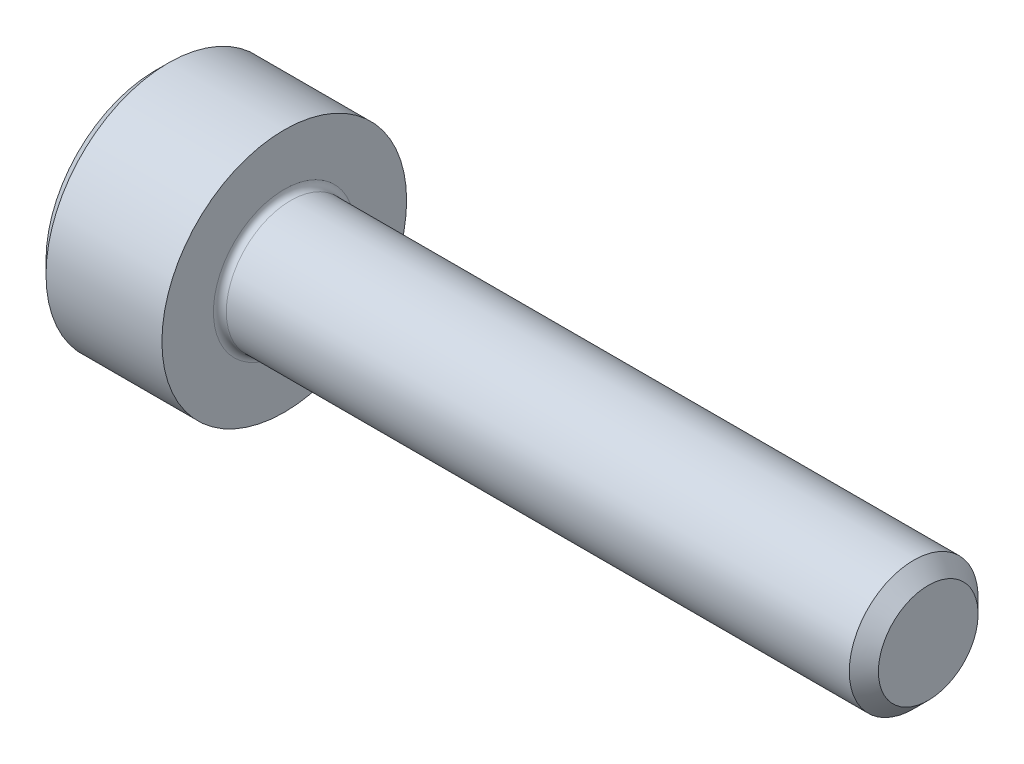
ISO-10303-21;
HEADER;
FILE_DESCRIPTION(('STEP AP214'),'2;1');
FILE_NAME('part.step','',(''),(''),'','','');
FILE_SCHEMA(('AUTOMOTIVE_DESIGN { 1 0 10303 214 1 1 1 1 }'));
ENDSEC;
DATA;
#1=APPLICATION_CONTEXT('core data for automotive mechanical design processes');
#2=APPLICATION_PROTOCOL_DEFINITION('international standard','automotive_design',2000,#1);
#3=PRODUCT_CONTEXT('',#1,'mechanical');
#4=PRODUCT('Part','Part','',(#3));
#5=PRODUCT_RELATED_PRODUCT_CATEGORY('part','',(#4));
#6=PRODUCT_DEFINITION_FORMATION('','',#4);
#7=PRODUCT_DEFINITION_CONTEXT('part definition',#1,'design');
#8=PRODUCT_DEFINITION('design','',#6,#7);
#9=PRODUCT_DEFINITION_SHAPE('','',#8);
#10=(LENGTH_UNIT() NAMED_UNIT(*) SI_UNIT(.MILLI.,.METRE.));
#11=(NAMED_UNIT(*) PLANE_ANGLE_UNIT() SI_UNIT($,.RADIAN.));
#12=(NAMED_UNIT(*) SI_UNIT($,.STERADIAN.) SOLID_ANGLE_UNIT());
#13=UNCERTAINTY_MEASURE_WITH_UNIT(LENGTH_MEASURE(1.E-05),#10,'distance_accuracy_value','');
#14=(GEOMETRIC_REPRESENTATION_CONTEXT(3) GLOBAL_UNCERTAINTY_ASSIGNED_CONTEXT((#13)) GLOBAL_UNIT_ASSIGNED_CONTEXT((#10,
#11,#12)) REPRESENTATION_CONTEXT('',''));
#15=CARTESIAN_POINT('',(0.,0.,0.));
#16=DIRECTION('',(0.,0.,1.));
#17=DIRECTION('',(1.,0.,0.));
#18=AXIS2_PLACEMENT_3D('',#15,#16,#17);
#19=CARTESIAN_POINT('',(0.,0.,0.));
#20=DIRECTION('',(-1.,0.,0.));
#21=DIRECTION('',(0.,0.,1.));
#22=AXIS2_PLACEMENT_3D('',#19,#20,#21);
#23=PLANE('',#22);
#24=DIRECTION('',(0.,-0.499999999999999,0.866025403784439));
#25=VECTOR('',#24,1.);
#26=CARTESIAN_POINT('',(0.,0.892006165897969,0.));
#27=LINE('',#26,#25);
#28=CARTESIAN_POINT('',(0.,0.892006165897969,0.));
#29=VERTEX_POINT('',#28);
#30=CARTESIAN_POINT('',(0.,0.446003082948983,0.772499999999997));
#31=VERTEX_POINT('',#30);
#32=EDGE_CURVE('E388',#29,#31,#27,.T.);
#33=ORIENTED_EDGE('',*,*,#32,.T.);
#34=DIRECTION('',(0.,1.,0.));
#35=VECTOR('',#34,1.);
#36=CARTESIAN_POINT('',(0.,-0.446003082948989,0.772499999999998));
#37=LINE('',#36,#35);
#38=CARTESIAN_POINT('',(0.,-0.446003082948989,0.772499999999998));
#39=VERTEX_POINT('',#38);
#40=EDGE_CURVE('E132',#39,#31,#37,.T.);
#41=ORIENTED_EDGE('',*,*,#40,.F.);
#42=DIRECTION('',(0.,-0.500000000000001,-0.866025403784438));
#43=VECTOR('',#42,1.);
#44=CARTESIAN_POINT('',(0.,-0.446003082948989,0.772499999999998));
#45=LINE('',#44,#43);
#46=CARTESIAN_POINT('',(0.,-0.892006165897975,0.));
#47=VERTEX_POINT('',#46);
#48=EDGE_CURVE('E391',#39,#47,#45,.T.);
#49=ORIENTED_EDGE('',*,*,#48,.T.);
#50=DIRECTION('',(0.,0.499999999999999,-0.866025403784439));
#51=VECTOR('',#50,1.);
#52=CARTESIAN_POINT('',(0.,-0.892006165897975,0.));
#53=LINE('',#52,#51);
#54=CARTESIAN_POINT('',(0.,-0.44600308294899,-0.772500000000001));
#55=VERTEX_POINT('',#54);
#56=EDGE_CURVE('E394',#47,#55,#53,.T.);
#57=ORIENTED_EDGE('',*,*,#56,.T.);
#58=DIRECTION('',(0.,-1.,0.));
#59=VECTOR('',#58,1.);
#60=CARTESIAN_POINT('',(0.,0.446003082948982,-0.772500000000003));
#61=LINE('',#60,#59);
#62=CARTESIAN_POINT('',(0.,0.446003082948982,-0.772500000000003));
#63=VERTEX_POINT('',#62);
#64=EDGE_CURVE('E397',#63,#55,#61,.T.);
#65=ORIENTED_EDGE('',*,*,#64,.F.);
#66=DIRECTION('',(0.,-0.500000000000001,-0.866025403784438));
#67=VECTOR('',#66,1.);
#68=CARTESIAN_POINT('',(0.,0.892006165897969,0.));
#69=LINE('',#68,#67);
#70=EDGE_CURVE('E127',#29,#63,#69,.T.);
#71=ORIENTED_EDGE('',*,*,#70,.F.);
#72=EDGE_LOOP('',(#33,#41,#49,#57,#65,#71));
#73=FACE_BOUND('',#72,.T.);
#74=CARTESIAN_POINT('',(0.,0.,0.));
#75=DIRECTION('',(-1.,0.,0.));
#76=DIRECTION('',(0.,0.,1.));
#77=AXIS2_PLACEMENT_3D('',#74,#75,#76);
#78=CIRCLE('',#77,1.70000000000001);
#79=CARTESIAN_POINT('',(0.,0.,1.70000000000001));
#80=VERTEX_POINT('',#79);
#81=EDGE_CURVE('E143',#80,#80,#78,.T.);
#82=ORIENTED_EDGE('',*,*,#81,.T.);
#83=EDGE_LOOP('',(#82));
#84=FACE_BOUND('',#83,.T.);
#85=ADVANCED_FACE('F36',(#73,#84),#23,.T.);
#86=CARTESIAN_POINT('',(12.,0.774,0.));
#87=DIRECTION('',(1.,0.,0.));
#88=DIRECTION('',(0.,0.,-1.));
#89=AXIS2_PLACEMENT_3D('',#86,#87,#88);
#90=PLANE('',#89);
#91=CARTESIAN_POINT('',(12.,0.,0.));
#92=DIRECTION('',(-1.,0.,0.));
#93=DIRECTION('',(0.,0.,1.));
#94=AXIS2_PLACEMENT_3D('',#91,#92,#93);
#95=CIRCLE('',#94,0.774);
#96=CARTESIAN_POINT('',(12.,0.,0.774));
#97=VERTEX_POINT('',#96);
#98=EDGE_CURVE('E156',#97,#97,#95,.T.);
#99=ORIENTED_EDGE('',*,*,#98,.F.);
#100=EDGE_LOOP('',(#99));
#101=FACE_BOUND('',#100,.T.);
#102=ADVANCED_FACE('F177',(#101),#90,.T.);
#103=CARTESIAN_POINT('',(12.,0.,0.));
#104=DIRECTION('',(-1.,0.,0.));
#105=DIRECTION('',(0.,0.,1.));
#106=AXIS2_PLACEMENT_3D('',#103,#104,#105);
#107=CONICAL_SURFACE('',#106,0.774,0.785398163397411);
#108=CARTESIAN_POINT('',(11.774,0.,0.));
#109=DIRECTION('',(-1.,0.,0.));
#110=DIRECTION('',(0.,0.,1.));
#111=AXIS2_PLACEMENT_3D('',#108,#109,#110);
#112=CIRCLE('',#111,0.999999999999987);
#113=CARTESIAN_POINT('',(11.774,0.,0.999999999999987));
#114=VERTEX_POINT('',#113);
#115=EDGE_CURVE('E153',#114,#114,#112,.T.);
#116=ORIENTED_EDGE('',*,*,#115,.F.);
#117=EDGE_LOOP('',(#116));
#118=FACE_BOUND('',#117,.T.);
#119=ORIENTED_EDGE('',*,*,#98,.T.);
#120=EDGE_LOOP('',(#119));
#121=FACE_BOUND('',#120,.T.);
#122=ADVANCED_FACE('F183',(#118,#121),#107,.T.);
#123=CARTESIAN_POINT('',(-31.75,0.,0.));
#124=DIRECTION('',(-1.,0.,0.));
#125=DIRECTION('',(0.,0.,1.));
#126=AXIS2_PLACEMENT_3D('',#123,#124,#125);
#127=CYLINDRICAL_SURFACE('',#126,0.999999999999994);
#128=CARTESIAN_POINT('',(2.1,0.,0.));
#129=DIRECTION('',(1.,0.,0.));
#130=DIRECTION('',(0.,0.,-1.));
#131=AXIS2_PLACEMENT_3D('',#128,#129,#130);
#132=CIRCLE('',#131,0.999999999999994);
#133=CARTESIAN_POINT('',(2.1,0.,-0.999999999999994));
#134=VERTEX_POINT('',#133);
#135=EDGE_CURVE('E11',#134,#134,#132,.T.);
#136=ORIENTED_EDGE('',*,*,#135,.T.);
#137=EDGE_LOOP('',(#136));
#138=FACE_BOUND('',#137,.T.);
#139=ORIENTED_EDGE('',*,*,#115,.T.);
#140=EDGE_LOOP('',(#139));
#141=FACE_BOUND('',#140,.T.);
#142=ADVANCED_FACE('F194',(#138,#141),#127,.T.);
#143=CARTESIAN_POINT('',(2.,1.9,0.));
#144=DIRECTION('',(1.,0.,0.));
#145=DIRECTION('',(0.,0.,-1.));
#146=AXIS2_PLACEMENT_3D('',#143,#144,#145);
#147=PLANE('',#146);
#148=CARTESIAN_POINT('',(2.,0.,0.));
#149=DIRECTION('',(1.,0.,0.));
#150=DIRECTION('',(0.,0.,-1.));
#151=AXIS2_PLACEMENT_3D('',#148,#149,#150);
#152=CIRCLE('',#151,1.09999999999999);
#153=CARTESIAN_POINT('',(2.,0.,-1.09999999999999));
#154=VERTEX_POINT('',#153);
#155=EDGE_CURVE('E44',#154,#154,#152,.F.);
#156=ORIENTED_EDGE('',*,*,#155,.T.);
#157=EDGE_LOOP('',(#156));
#158=FACE_BOUND('',#157,.T.);
#159=CARTESIAN_POINT('',(2.,0.,0.));
#160=DIRECTION('',(-1.,0.,0.));
#161=DIRECTION('',(0.,0.,1.));
#162=AXIS2_PLACEMENT_3D('',#159,#160,#161);
#163=CIRCLE('',#162,1.9);
#164=CARTESIAN_POINT('',(2.,0.,1.9));
#165=VERTEX_POINT('',#164);
#166=EDGE_CURVE('E150',#165,#165,#163,.T.);
#167=ORIENTED_EDGE('',*,*,#166,.F.);
#168=EDGE_LOOP('',(#167));
#169=FACE_BOUND('',#168,.T.);
#170=ADVANCED_FACE('F161',(#158,#169),#147,.T.);
#171=CARTESIAN_POINT('',(-31.75,0.,0.));
#172=DIRECTION('',(-1.,0.,0.));
#173=DIRECTION('',(0.,0.,1.));
#174=AXIS2_PLACEMENT_3D('',#171,#172,#173);
#175=CYLINDRICAL_SURFACE('',#174,1.9);
#176=ORIENTED_EDGE('',*,*,#166,.T.);
#177=EDGE_LOOP('',(#176));
#178=FACE_BOUND('',#177,.T.);
#179=CARTESIAN_POINT('',(0.199999999999999,0.,0.));
#180=DIRECTION('',(-1.,0.,0.));
#181=DIRECTION('',(0.,0.,1.));
#182=AXIS2_PLACEMENT_3D('',#179,#180,#181);
#183=CIRCLE('',#182,1.9);
#184=CARTESIAN_POINT('',(0.199999999999999,0.,1.9));
#185=VERTEX_POINT('',#184);
#186=EDGE_CURVE('E147',#185,#185,#183,.T.);
#187=ORIENTED_EDGE('',*,*,#186,.F.);
#188=EDGE_LOOP('',(#187));
#189=FACE_BOUND('',#188,.T.);
#190=ADVANCED_FACE('F172',(#178,#189),#175,.T.);
#191=CARTESIAN_POINT('',(0.,0.,0.));
#192=DIRECTION('',(1.,0.,0.));
#193=DIRECTION('',(0.,0.,-1.));
#194=AXIS2_PLACEMENT_3D('',#191,#192,#193);
#195=CONICAL_SURFACE('',#194,1.70000000000001,0.785398163397435);
#196=ORIENTED_EDGE('',*,*,#186,.T.);
#197=EDGE_LOOP('',(#196));
#198=FACE_BOUND('',#197,.T.);
#199=ORIENTED_EDGE('',*,*,#81,.F.);
#200=EDGE_LOOP('',(#199));
#201=FACE_BOUND('',#200,.T.);
#202=ADVANCED_FACE('F165',(#198,#201),#195,.T.);
#203=CARTESIAN_POINT('',(2.1,0.,0.));
#204=DIRECTION('',(1.,0.,0.));
#205=DIRECTION('',(0.,0.,-1.));
#206=AXIS2_PLACEMENT_3D('',#203,#204,#205);
#207=TOROIDAL_SURFACE('',#206,1.09999999999999,0.1);
#208=ORIENTED_EDGE('',*,*,#135,.F.);
#209=EDGE_LOOP('',(#208));
#210=FACE_BOUND('',#209,.T.);
#211=ORIENTED_EDGE('',*,*,#155,.F.);
#212=EDGE_LOOP('',(#211));
#213=FACE_BOUND('',#212,.T.);
#214=ADVANCED_FACE('F38',(#210,#213),#207,.F.);
#215=CARTESIAN_POINT('',(1.,0.892006165897969,0.));
#216=DIRECTION('',(0.,-0.866025403784439,-0.499999999999999));
#217=DIRECTION('',(0.,0.499999999999999,-0.866025403784439));
#218=AXIS2_PLACEMENT_3D('',#215,#216,#217);
#219=PLANE('',#218);
#220=ORIENTED_EDGE('',*,*,#32,.F.);
#221=DIRECTION('',(-1.,0.,0.));
#222=VECTOR('',#221,1.);
#223=CARTESIAN_POINT('',(1.,0.892006165897969,0.));
#224=LINE('',#223,#222);
#225=CARTESIAN_POINT('',(1.,0.892006165897969,0.));
#226=VERTEX_POINT('',#225);
#227=EDGE_CURVE('E378',#226,#29,#224,.T.);
#228=ORIENTED_EDGE('',*,*,#227,.F.);
#229=DIRECTION('',(0.,-0.499999999999999,0.866025403784439));
#230=VECTOR('',#229,1.);
#231=CARTESIAN_POINT('',(1.,0.892006165897969,0.));
#232=LINE('',#231,#230);
#233=CARTESIAN_POINT('',(1.,0.669004624423476,0.386249999999998));
#234=VERTEX_POINT('',#233);
#235=EDGE_CURVE('E119',#226,#234,#232,.T.);
#236=ORIENTED_EDGE('',*,*,#235,.T.);
#237=CARTESIAN_POINT('',(1.,0.446003082948983,0.772499999999997));
#238=VERTEX_POINT('',#237);
#239=EDGE_CURVE('E110',#234,#238,#232,.T.);
#240=ORIENTED_EDGE('',*,*,#239,.T.);
#241=DIRECTION('',(-1.,0.,0.));
#242=VECTOR('',#241,1.);
#243=CARTESIAN_POINT('',(1.,0.446003082948983,0.772499999999997));
#244=LINE('',#243,#242);
#245=EDGE_CURVE('E124',#238,#31,#244,.T.);
#246=ORIENTED_EDGE('',*,*,#245,.T.);
#247=EDGE_LOOP('',(#220,#228,#236,#240,#246));
#248=FACE_BOUND('',#247,.T.);
#249=ADVANCED_FACE('F123',(#248),#219,.T.);
#250=CARTESIAN_POINT('',(1.,-0.446003082948989,0.772499999999998));
#251=DIRECTION('',(0.,0.,1.));
#252=DIRECTION('',(0.,-1.,0.));
#253=AXIS2_PLACEMENT_3D('',#250,#251,#252);
#254=PLANE('',#253);
#255=ORIENTED_EDGE('',*,*,#40,.T.);
#256=ORIENTED_EDGE('',*,*,#245,.F.);
#257=DIRECTION('',(0.,1.,0.));
#258=VECTOR('',#257,1.);
#259=CARTESIAN_POINT('',(1.,-0.446003082948989,0.772499999999998));
#260=LINE('',#259,#258);
#261=CARTESIAN_POINT('',(1.,0.,0.772499999999998));
#262=VERTEX_POINT('',#261);
#263=EDGE_CURVE('E107',#262,#238,#260,.T.);
#264=ORIENTED_EDGE('',*,*,#263,.F.);
#265=CARTESIAN_POINT('',(1.,-0.446003082948989,0.772499999999998));
#266=VERTEX_POINT('',#265);
#267=EDGE_CURVE('E118',#266,#262,#260,.T.);
#268=ORIENTED_EDGE('',*,*,#267,.F.);
#269=DIRECTION('',(-1.,0.,0.));
#270=VECTOR('',#269,1.);
#271=CARTESIAN_POINT('',(1.,-0.446003082948989,0.772499999999998));
#272=LINE('',#271,#270);
#273=EDGE_CURVE('E134',#266,#39,#272,.T.);
#274=ORIENTED_EDGE('',*,*,#273,.T.);
#275=EDGE_LOOP('',(#255,#256,#264,#268,#274));
#276=FACE_BOUND('',#275,.T.);
#277=ADVANCED_FACE('F129',(#276),#254,.F.);
#278=CARTESIAN_POINT('',(1.,-0.446003082948989,0.772499999999998));
#279=DIRECTION('',(0.,0.866025403784438,-0.500000000000001));
#280=DIRECTION('',(0.,0.500000000000001,0.866025403784438));
#281=AXIS2_PLACEMENT_3D('',#278,#279,#280);
#282=PLANE('',#281);
#283=ORIENTED_EDGE('',*,*,#48,.F.);
#284=ORIENTED_EDGE('',*,*,#273,.F.);
#285=DIRECTION('',(0.,-0.500000000000001,-0.866025403784438));
#286=VECTOR('',#285,1.);
#287=CARTESIAN_POINT('',(1.,-0.446003082948989,0.772499999999998));
#288=LINE('',#287,#286);
#289=CARTESIAN_POINT('',(1.,-0.66900462442348,0.386250000000002));
#290=VERTEX_POINT('',#289);
#291=EDGE_CURVE('E417',#266,#290,#288,.T.);
#292=ORIENTED_EDGE('',*,*,#291,.T.);
#293=CARTESIAN_POINT('',(1.,-0.892006165897975,0.));
#294=VERTEX_POINT('',#293);
#295=EDGE_CURVE('E406',#290,#294,#288,.T.);
#296=ORIENTED_EDGE('',*,*,#295,.T.);
#297=DIRECTION('',(-1.,0.,0.));
#298=VECTOR('',#297,1.);
#299=CARTESIAN_POINT('',(1.,-0.892006165897975,0.));
#300=LINE('',#299,#298);
#301=EDGE_CURVE('E139',#294,#47,#300,.T.);
#302=ORIENTED_EDGE('',*,*,#301,.T.);
#303=EDGE_LOOP('',(#283,#284,#292,#296,#302));
#304=FACE_BOUND('',#303,.T.);
#305=ADVANCED_FACE('F269',(#304),#282,.T.);
#306=CARTESIAN_POINT('',(1.,-0.892006165897975,0.));
#307=DIRECTION('',(0.,0.866025403784439,0.5));
#308=DIRECTION('',(0.,-0.499999999999999,0.866025403784439));
#309=AXIS2_PLACEMENT_3D('',#306,#307,#308);
#310=PLANE('',#309);
#311=ORIENTED_EDGE('',*,*,#56,.F.);
#312=ORIENTED_EDGE('',*,*,#301,.F.);
#313=DIRECTION('',(0.,0.499999999999999,-0.866025403784439));
#314=VECTOR('',#313,1.);
#315=CARTESIAN_POINT('',(1.,-0.892006165897975,0.));
#316=LINE('',#315,#314);
#317=CARTESIAN_POINT('',(1.,-0.669004624423482,-0.386250000000001));
#318=VERTEX_POINT('',#317);
#319=EDGE_CURVE('E384',#294,#318,#316,.T.);
#320=ORIENTED_EDGE('',*,*,#319,.T.);
#321=CARTESIAN_POINT('',(1.,-0.44600308294899,-0.772500000000001));
#322=VERTEX_POINT('',#321);
#323=EDGE_CURVE('E416',#318,#322,#316,.T.);
#324=ORIENTED_EDGE('',*,*,#323,.T.);
#325=DIRECTION('',(-1.,0.,0.));
#326=VECTOR('',#325,1.);
#327=CARTESIAN_POINT('',(1.,-0.44600308294899,-0.772500000000001));
#328=LINE('',#327,#326);
#329=EDGE_CURVE('E377',#322,#55,#328,.T.);
#330=ORIENTED_EDGE('',*,*,#329,.T.);
#331=EDGE_LOOP('',(#311,#312,#320,#324,#330));
#332=FACE_BOUND('',#331,.T.);
#333=ADVANCED_FACE('F277',(#332),#310,.T.);
#334=CARTESIAN_POINT('',(1.,0.446003082948982,-0.772500000000003));
#335=DIRECTION('',(0.,0.,-1.));
#336=DIRECTION('',(0.,1.,0.));
#337=AXIS2_PLACEMENT_3D('',#334,#335,#336);
#338=PLANE('',#337);
#339=ORIENTED_EDGE('',*,*,#64,.T.);
#340=ORIENTED_EDGE('',*,*,#329,.F.);
#341=DIRECTION('',(0.,-1.,0.));
#342=VECTOR('',#341,1.);
#343=CARTESIAN_POINT('',(1.,0.446003082948982,-0.772500000000003));
#344=LINE('',#343,#342);
#345=CARTESIAN_POINT('',(1.,0.,-0.772500000000002));
#346=VERTEX_POINT('',#345);
#347=EDGE_CURVE('E381',#346,#322,#344,.T.);
#348=ORIENTED_EDGE('',*,*,#347,.F.);
#349=CARTESIAN_POINT('',(1.,0.446003082948982,-0.772500000000003));
#350=VERTEX_POINT('',#349);
#351=EDGE_CURVE('E51',#350,#346,#344,.T.);
#352=ORIENTED_EDGE('',*,*,#351,.F.);
#353=DIRECTION('',(-1.,0.,0.));
#354=VECTOR('',#353,1.);
#355=CARTESIAN_POINT('',(1.,0.446003082948982,-0.772500000000003));
#356=LINE('',#355,#354);
#357=EDGE_CURVE('E374',#350,#63,#356,.T.);
#358=ORIENTED_EDGE('',*,*,#357,.T.);
#359=EDGE_LOOP('',(#339,#340,#348,#352,#358));
#360=FACE_BOUND('',#359,.T.);
#361=ADVANCED_FACE('F286',(#360),#338,.F.);
#362=CARTESIAN_POINT('',(1.,0.892006165897969,0.));
#363=DIRECTION('',(0.,0.866025403784438,-0.500000000000001));
#364=DIRECTION('',(0.,0.500000000000001,0.866025403784438));
#365=AXIS2_PLACEMENT_3D('',#362,#363,#364);
#366=PLANE('',#365);
#367=ORIENTED_EDGE('',*,*,#70,.T.);
#368=ORIENTED_EDGE('',*,*,#357,.F.);
#369=DIRECTION('',(0.,-0.500000000000001,-0.866025403784438));
#370=VECTOR('',#369,1.);
#371=CARTESIAN_POINT('',(1.,0.892006165897969,0.));
#372=LINE('',#371,#370);
#373=CARTESIAN_POINT('',(1.,0.669004624423477,-0.38625));
#374=VERTEX_POINT('',#373);
#375=EDGE_CURVE('E364',#374,#350,#372,.T.);
#376=ORIENTED_EDGE('',*,*,#375,.F.);
#377=EDGE_CURVE('E370',#226,#374,#372,.T.);
#378=ORIENTED_EDGE('',*,*,#377,.F.);
#379=ORIENTED_EDGE('',*,*,#227,.T.);
#380=EDGE_LOOP('',(#367,#368,#376,#378,#379));
#381=FACE_BOUND('',#380,.T.);
#382=ADVANCED_FACE('F295',(#381),#366,.F.);
#383=CARTESIAN_POINT('',(1.,0.,1.545));
#384=DIRECTION('',(1.,0.,0.));
#385=DIRECTION('',(0.,0.,-1.));
#386=AXIS2_PLACEMENT_3D('',#383,#384,#385);
#387=PLANE('',#386);
#388=ORIENTED_EDGE('',*,*,#347,.T.);
#389=ORIENTED_EDGE('',*,*,#323,.F.);
#390=CARTESIAN_POINT('',(1.,0.,0.));
#391=DIRECTION('',(-1.,0.,0.));
#392=DIRECTION('',(0.,0.,1.));
#393=AXIS2_PLACEMENT_3D('',#390,#391,#392);
#394=CIRCLE('',#393,0.772500000000002);
#395=EDGE_CURVE('E412',#346,#318,#394,.T.);
#396=ORIENTED_EDGE('',*,*,#395,.F.);
#397=EDGE_LOOP('',(#388,#389,#396));
#398=FACE_BOUND('',#397,.T.);
#399=ADVANCED_FACE('F304',(#398),#387,.F.);
#400=ORIENTED_EDGE('',*,*,#319,.F.);
#401=ORIENTED_EDGE('',*,*,#295,.F.);
#402=EDGE_CURVE('E137',#318,#290,#394,.T.);
#403=ORIENTED_EDGE('',*,*,#402,.F.);
#404=EDGE_LOOP('',(#400,#401,#403));
#405=FACE_BOUND('',#404,.T.);
#406=ADVANCED_FACE('F313',(#405),#387,.F.);
#407=ORIENTED_EDGE('',*,*,#291,.F.);
#408=ORIENTED_EDGE('',*,*,#267,.T.);
#409=EDGE_CURVE('E133',#290,#262,#394,.T.);
#410=ORIENTED_EDGE('',*,*,#409,.F.);
#411=EDGE_LOOP('',(#407,#408,#410));
#412=FACE_BOUND('',#411,.T.);
#413=ADVANCED_FACE('F322',(#412),#387,.F.);
#414=ORIENTED_EDGE('',*,*,#263,.T.);
#415=ORIENTED_EDGE('',*,*,#239,.F.);
#416=EDGE_CURVE('E113',#262,#234,#394,.T.);
#417=ORIENTED_EDGE('',*,*,#416,.F.);
#418=EDGE_LOOP('',(#414,#415,#417));
#419=FACE_BOUND('',#418,.T.);
#420=ADVANCED_FACE('F109',(#419),#387,.F.);
#421=ORIENTED_EDGE('',*,*,#235,.F.);
#422=ORIENTED_EDGE('',*,*,#377,.T.);
#423=EDGE_CURVE('E144',#234,#374,#394,.T.);
#424=ORIENTED_EDGE('',*,*,#423,.F.);
#425=EDGE_LOOP('',(#421,#422,#424));
#426=FACE_BOUND('',#425,.T.);
#427=ADVANCED_FACE('F337',(#426),#387,.F.);
#428=ORIENTED_EDGE('',*,*,#375,.T.);
#429=ORIENTED_EDGE('',*,*,#351,.T.);
#430=EDGE_CURVE('E367',#374,#346,#394,.T.);
#431=ORIENTED_EDGE('',*,*,#430,.F.);
#432=EDGE_LOOP('',(#428,#429,#431));
#433=FACE_BOUND('',#432,.T.);
#434=ADVANCED_FACE('F252',(#433),#387,.F.);
#435=CARTESIAN_POINT('',(1.,0.,0.));
#436=DIRECTION('',(-1.,0.,0.));
#437=DIRECTION('',(0.,0.,1.));
#438=AXIS2_PLACEMENT_3D('',#435,#436,#437);
#439=CONICAL_SURFACE('',#438,0.772500000000002,1.04719755119659);
#440=CARTESIAN_POINT('',(1.446003082949,0.,0.));
#441=VERTEX_POINT('',#440);
#442=VERTEX_LOOP('',#441);
#443=FACE_BOUND('',#442,.T.);
#444=ORIENTED_EDGE('',*,*,#416,.T.);
#445=ORIENTED_EDGE('',*,*,#423,.T.);
#446=ORIENTED_EDGE('',*,*,#430,.T.);
#447=ORIENTED_EDGE('',*,*,#395,.T.);
#448=ORIENTED_EDGE('',*,*,#402,.T.);
#449=ORIENTED_EDGE('',*,*,#409,.T.);
#450=EDGE_LOOP('',(#444,#445,#446,#447,#448,#449));
#451=FACE_BOUND('',#450,.T.);
#452=ADVANCED_FACE('F187',(#443,#451),#439,.F.);
#453=CLOSED_SHELL('',(#85,#102,#122,#142,#170,#190,#202,#214,#249,#277,#305,#333,#361,#382,#399,
#406,#413,#420,#427,#434,#452));
#454=MANIFOLD_SOLID_BREP('B2',#453);
#455=ADVANCED_BREP_SHAPE_REPRESENTATION('',(#18,#454),#14);
#456=SHAPE_DEFINITION_REPRESENTATION(#9,#455);
ENDSEC;
END-ISO-10303-21;
